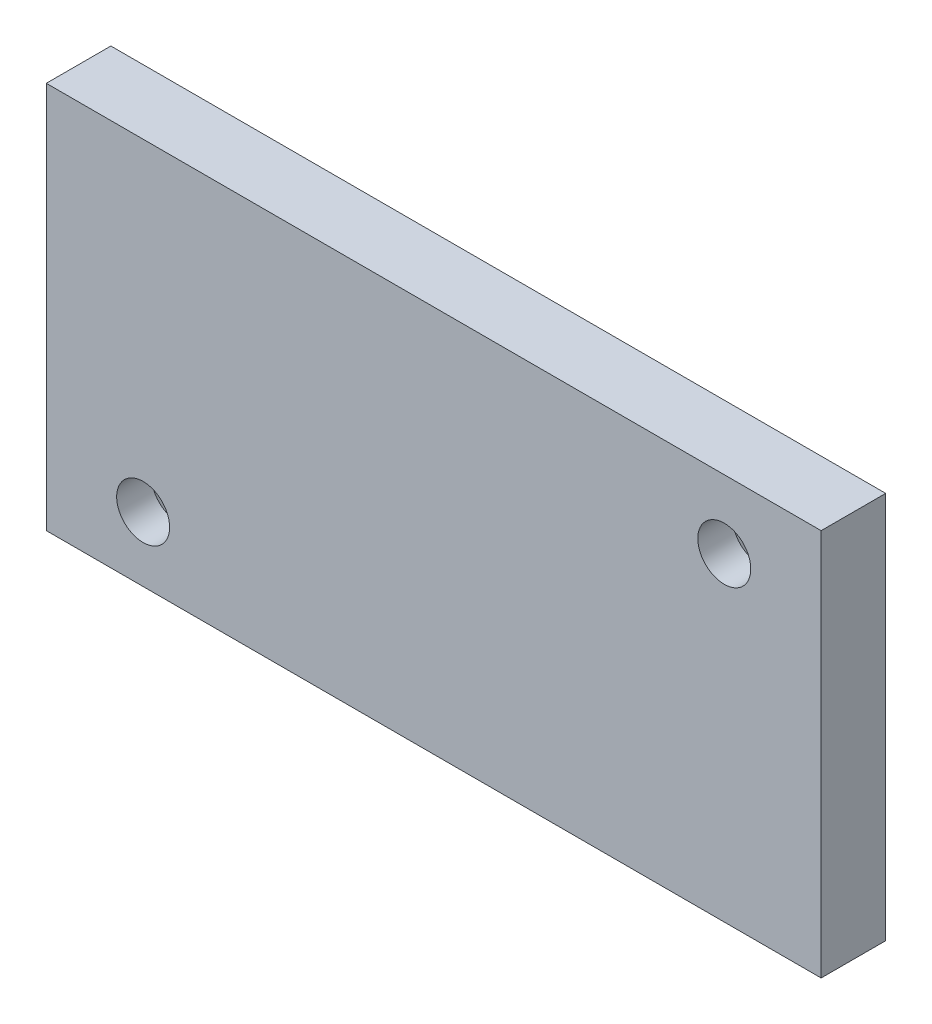
ISO-10303-21;
HEADER;
FILE_DESCRIPTION(('STEP AP214'),'2;1');
FILE_NAME('part.step','',(''),(''),'','','');
FILE_SCHEMA(('AUTOMOTIVE_DESIGN { 1 0 10303 214 1 1 1 1 }'));
ENDSEC;
DATA;
#1=APPLICATION_CONTEXT('core data for automotive mechanical design processes');
#2=APPLICATION_PROTOCOL_DEFINITION('international standard','automotive_design',2000,#1);
#3=PRODUCT_CONTEXT('',#1,'mechanical');
#4=PRODUCT('Part','Part','',(#3));
#5=PRODUCT_RELATED_PRODUCT_CATEGORY('part','',(#4));
#6=PRODUCT_DEFINITION_FORMATION('','',#4);
#7=PRODUCT_DEFINITION_CONTEXT('part definition',#1,'design');
#8=PRODUCT_DEFINITION('design','',#6,#7);
#9=PRODUCT_DEFINITION_SHAPE('','',#8);
#10=(LENGTH_UNIT() NAMED_UNIT(*) SI_UNIT(.MILLI.,.METRE.));
#11=(NAMED_UNIT(*) PLANE_ANGLE_UNIT() SI_UNIT($,.RADIAN.));
#12=(NAMED_UNIT(*) SI_UNIT($,.STERADIAN.) SOLID_ANGLE_UNIT());
#13=UNCERTAINTY_MEASURE_WITH_UNIT(LENGTH_MEASURE(1.E-05),#10,'distance_accuracy_value','');
#14=(GEOMETRIC_REPRESENTATION_CONTEXT(3) GLOBAL_UNCERTAINTY_ASSIGNED_CONTEXT((#13)) GLOBAL_UNIT_ASSIGNED_CONTEXT((#10,
#11,#12)) REPRESENTATION_CONTEXT('',''));
#15=CARTESIAN_POINT('',(0.,0.,0.));
#16=DIRECTION('',(0.,0.,1.));
#17=DIRECTION('',(1.,0.,0.));
#18=AXIS2_PLACEMENT_3D('',#15,#16,#17);
#19=CARTESIAN_POINT('',(0.,0.,17.78));
#20=DIRECTION('',(0.,0.,1.));
#21=DIRECTION('',(1.,0.,0.));
#22=AXIS2_PLACEMENT_3D('',#19,#20,#21);
#23=PLANE('',#22);
#24=DIRECTION('',(0.,-1.,0.));
#25=VECTOR('',#24,1.);
#26=CARTESIAN_POINT('',(-2.54,-2.54000000000001,17.78));
#27=LINE('',#26,#25);
#28=CARTESIAN_POINT('',(-2.54,-28.3861235613282,17.78));
#29=VERTEX_POINT('',#28);
#30=CARTESIAN_POINT('',(-2.54,-32.385,17.78));
#31=VERTEX_POINT('',#30);
#32=EDGE_CURVE('E274',#29,#31,#27,.T.);
#33=ORIENTED_EDGE('',*,*,#32,.F.);
#34=CARTESIAN_POINT('',(-5.715,-28.3861235613282,17.78));
#35=DIRECTION('',(0.,0.,1.));
#36=DIRECTION('',(1.,0.,0.));
#37=AXIS2_PLACEMENT_3D('',#34,#35,#36);
#38=CIRCLE('',#37,3.175);
#39=CARTESIAN_POINT('',(-5.88936147740391,-25.2159148812572,17.78));
#40=VERTEX_POINT('',#39);
#41=EDGE_CURVE('E213',#29,#40,#38,.T.);
#42=ORIENTED_EDGE('',*,*,#41,.T.);
#43=DIRECTION('',(-0.998490922857009,-0.0549170007571353,0.));
#44=VECTOR('',#43,1.);
#45=CARTESIAN_POINT('',(1.36493108347249,-24.816928790409,17.78));
#46=LINE('',#45,#44);
#47=CARTESIAN_POINT('',(-70.6593614774039,-28.7782648812572,17.78));
#48=VERTEX_POINT('',#47);
#49=EDGE_CURVE('E291',#40,#48,#46,.T.);
#50=ORIENTED_EDGE('',*,*,#49,.T.);
#51=CARTESIAN_POINT('',(-70.485,-31.9484735613282,17.78));
#52=DIRECTION('',(0.,0.,1.));
#53=DIRECTION('',(1.,0.,0.));
#54=AXIS2_PLACEMENT_3D('',#51,#52,#53);
#55=CIRCLE('',#54,3.175);
#56=CARTESIAN_POINT('',(-73.66,-31.9484735613282,17.78));
#57=VERTEX_POINT('',#56);
#58=EDGE_CURVE('E357',#48,#57,#55,.T.);
#59=ORIENTED_EDGE('',*,*,#58,.T.);
#60=DIRECTION('',(0.,1.,0.));
#61=VECTOR('',#60,1.);
#62=CARTESIAN_POINT('',(-73.66,-35.56,17.78));
#63=LINE('',#62,#61);
#64=CARTESIAN_POINT('',(-73.66,-32.385,17.78));
#65=VERTEX_POINT('',#64);
#66=EDGE_CURVE('E284',#65,#57,#63,.T.);
#67=ORIENTED_EDGE('',*,*,#66,.F.);
#68=CARTESIAN_POINT('',(-70.485,-32.385,17.78));
#69=DIRECTION('',(0.,0.,1.));
#70=DIRECTION('',(1.,0.,0.));
#71=AXIS2_PLACEMENT_3D('',#68,#69,#70);
#72=CIRCLE('',#71,3.175);
#73=CARTESIAN_POINT('',(-70.485,-35.56,17.78));
#74=VERTEX_POINT('',#73);
#75=EDGE_CURVE('E359',#65,#74,#72,.T.);
#76=ORIENTED_EDGE('',*,*,#75,.T.);
#77=DIRECTION('',(-1.,0.,0.));
#78=VECTOR('',#77,1.);
#79=CARTESIAN_POINT('',(-2.54,-35.56,17.78));
#80=LINE('',#79,#78);
#81=CARTESIAN_POINT('',(-5.715,-35.56,17.78));
#82=VERTEX_POINT('',#81);
#83=EDGE_CURVE('E278',#82,#74,#80,.T.);
#84=ORIENTED_EDGE('',*,*,#83,.F.);
#85=CARTESIAN_POINT('',(-5.715,-32.385,17.78));
#86=DIRECTION('',(0.,0.,1.));
#87=DIRECTION('',(1.,0.,0.));
#88=AXIS2_PLACEMENT_3D('',#85,#86,#87);
#89=CIRCLE('',#88,3.175);
#90=EDGE_CURVE('E354',#82,#31,#89,.T.);
#91=ORIENTED_EDGE('',*,*,#90,.T.);
#92=EDGE_LOOP('',(#33,#42,#50,#59,#67,#76,#84,#91));
#93=FACE_BOUND('',#92,.T.);
#94=DIRECTION('',(-0.998490922857009,0.0549170007571357,0.));
#95=VECTOR('',#94,1.);
#96=CARTESIAN_POINT('',(-0.724249146332348,-13.1681662969517,17.78));
#97=LINE('',#96,#95);
#98=CARTESIAN_POINT('',(-5.88936147740391,-12.8840851187428,17.78));
#99=VERTEX_POINT('',#98);
#100=CARTESIAN_POINT('',(-70.6593614774039,-9.32173511874278,17.78));
#101=VERTEX_POINT('',#100);
#102=EDGE_CURVE('E292',#99,#101,#97,.T.);
#103=ORIENTED_EDGE('',*,*,#102,.F.);
#104=CARTESIAN_POINT('',(-5.715,-9.71387643867179,17.78));
#105=DIRECTION('',(0.,0.,1.));
#106=DIRECTION('',(1.,0.,0.));
#107=AXIS2_PLACEMENT_3D('',#104,#105,#106);
#108=CIRCLE('',#107,3.175);
#109=CARTESIAN_POINT('',(-2.54,-9.71387643867179,17.78));
#110=VERTEX_POINT('',#109);
#111=EDGE_CURVE('E363',#99,#110,#108,.T.);
#112=ORIENTED_EDGE('',*,*,#111,.T.);
#113=CARTESIAN_POINT('',(-2.54,-5.71500000000001,17.78));
#114=VERTEX_POINT('',#113);
#115=EDGE_CURVE('E275',#114,#110,#27,.T.);
#116=ORIENTED_EDGE('',*,*,#115,.F.);
#117=CARTESIAN_POINT('',(-5.715,-5.71500000000001,17.78));
#118=DIRECTION('',(0.,0.,1.));
#119=DIRECTION('',(1.,0.,0.));
#120=AXIS2_PLACEMENT_3D('',#117,#118,#119);
#121=CIRCLE('',#120,3.175);
#122=CARTESIAN_POINT('',(-5.71500000000003,-2.54000000000001,17.78));
#123=VERTEX_POINT('',#122);
#124=EDGE_CURVE('E83',#114,#123,#121,.T.);
#125=ORIENTED_EDGE('',*,*,#124,.T.);
#126=DIRECTION('',(1.,0.,0.));
#127=VECTOR('',#126,1.);
#128=CARTESIAN_POINT('',(-73.66,-2.54,17.78));
#129=LINE('',#128,#127);
#130=CARTESIAN_POINT('',(-70.485,-2.54,17.78));
#131=VERTEX_POINT('',#130);
#132=EDGE_CURVE('E272',#131,#123,#129,.T.);
#133=ORIENTED_EDGE('',*,*,#132,.F.);
#134=CARTESIAN_POINT('',(-70.485,-5.715,17.78));
#135=DIRECTION('',(0.,0.,1.));
#136=DIRECTION('',(1.,0.,0.));
#137=AXIS2_PLACEMENT_3D('',#134,#135,#136);
#138=CIRCLE('',#137,3.175);
#139=CARTESIAN_POINT('',(-73.66,-5.715,17.78));
#140=VERTEX_POINT('',#139);
#141=EDGE_CURVE('E366',#131,#140,#138,.T.);
#142=ORIENTED_EDGE('',*,*,#141,.T.);
#143=CARTESIAN_POINT('',(-73.66,-6.15152643867178,17.78));
#144=VERTEX_POINT('',#143);
#145=EDGE_CURVE('E281',#144,#140,#63,.T.);
#146=ORIENTED_EDGE('',*,*,#145,.F.);
#147=CARTESIAN_POINT('',(-70.485,-6.15152643867178,17.78));
#148=DIRECTION('',(0.,0.,1.));
#149=DIRECTION('',(1.,0.,0.));
#150=AXIS2_PLACEMENT_3D('',#147,#148,#149);
#151=CIRCLE('',#150,3.175);
#152=EDGE_CURVE('E361',#144,#101,#151,.T.);
#153=ORIENTED_EDGE('',*,*,#152,.T.);
#154=EDGE_LOOP('',(#103,#112,#116,#125,#133,#142,#146,#153));
#155=FACE_BOUND('',#154,.T.);
#156=DIRECTION('',(-1.,0.,0.));
#157=VECTOR('',#156,1.);
#158=CARTESIAN_POINT('',(0.,-38.1,17.78));
#159=LINE('',#158,#157);
#160=CARTESIAN_POINT('',(0.,-38.1,17.78));
#161=VERTEX_POINT('',#160);
#162=CARTESIAN_POINT('',(-76.2,-38.1,17.78));
#163=VERTEX_POINT('',#162);
#164=EDGE_CURVE('E285',#161,#163,#159,.T.);
#165=ORIENTED_EDGE('',*,*,#164,.T.);
#166=DIRECTION('',(0.,-1.,0.));
#167=VECTOR('',#166,1.);
#168=CARTESIAN_POINT('',(-76.2,0.,17.78));
#169=LINE('',#168,#167);
#170=CARTESIAN_POINT('',(-76.2,0.,17.78));
#171=VERTEX_POINT('',#170);
#172=EDGE_CURVE('E303',#171,#163,#169,.T.);
#173=ORIENTED_EDGE('',*,*,#172,.F.);
#174=DIRECTION('',(1.,0.,0.));
#175=VECTOR('',#174,1.);
#176=CARTESIAN_POINT('',(-76.2,0.,17.78));
#177=LINE('',#176,#175);
#178=CARTESIAN_POINT('',(0.,0.,17.78));
#179=VERTEX_POINT('',#178);
#180=EDGE_CURVE('E288',#171,#179,#177,.T.);
#181=ORIENTED_EDGE('',*,*,#180,.T.);
#182=DIRECTION('',(0.,1.,0.));
#183=VECTOR('',#182,1.);
#184=CARTESIAN_POINT('',(0.,0.,17.78));
#185=LINE('',#184,#183);
#186=EDGE_CURVE('E308',#161,#179,#185,.T.);
#187=ORIENTED_EDGE('',*,*,#186,.F.);
#188=EDGE_LOOP('',(#165,#173,#181,#187));
#189=FACE_BOUND('',#188,.T.);
#190=ADVANCED_FACE('F67',(#93,#155,#189),#23,.F.);
#191=CARTESIAN_POINT('',(-76.2,0.,24.13));
#192=DIRECTION('',(1.,0.,0.));
#193=DIRECTION('',(0.,0.,-1.));
#194=AXIS2_PLACEMENT_3D('',#191,#192,#193);
#195=PLANE('',#194);
#196=ORIENTED_EDGE('',*,*,#172,.T.);
#197=DIRECTION('',(0.,0.,-1.));
#198=VECTOR('',#197,1.);
#199=CARTESIAN_POINT('',(-76.2,-38.1,24.13));
#200=LINE('',#199,#198);
#201=CARTESIAN_POINT('',(-76.2,-38.1,24.13));
#202=VERTEX_POINT('',#201);
#203=EDGE_CURVE('E218',#202,#163,#200,.T.);
#204=ORIENTED_EDGE('',*,*,#203,.F.);
#205=DIRECTION('',(0.,-1.,0.));
#206=VECTOR('',#205,1.);
#207=CARTESIAN_POINT('',(-76.2,0.,24.13));
#208=LINE('',#207,#206);
#209=CARTESIAN_POINT('',(-76.2,0.,24.13));
#210=VERTEX_POINT('',#209);
#211=EDGE_CURVE('E304',#210,#202,#208,.T.);
#212=ORIENTED_EDGE('',*,*,#211,.F.);
#213=DIRECTION('',(0.,0.,-1.));
#214=VECTOR('',#213,1.);
#215=CARTESIAN_POINT('',(-76.2,0.,24.13));
#216=LINE('',#215,#214);
#217=EDGE_CURVE('E314',#210,#171,#216,.T.);
#218=ORIENTED_EDGE('',*,*,#217,.T.);
#219=EDGE_LOOP('',(#196,#204,#212,#218));
#220=FACE_BOUND('',#219,.T.);
#221=ADVANCED_FACE('F388',(#220),#195,.F.);
#222=CARTESIAN_POINT('',(-76.2,-38.1,24.13));
#223=DIRECTION('',(0.,1.,0.));
#224=DIRECTION('',(0.,0.,1.));
#225=AXIS2_PLACEMENT_3D('',#222,#223,#224);
#226=PLANE('',#225);
#227=ORIENTED_EDGE('',*,*,#164,.F.);
#228=DIRECTION('',(0.,0.,-1.));
#229=VECTOR('',#228,1.);
#230=CARTESIAN_POINT('',(0.,-38.1,24.13));
#231=LINE('',#230,#229);
#232=CARTESIAN_POINT('',(0.,-38.1,24.13));
#233=VERTEX_POINT('',#232);
#234=EDGE_CURVE('E322',#233,#161,#231,.T.);
#235=ORIENTED_EDGE('',*,*,#234,.F.);
#236=DIRECTION('',(1.,0.,0.));
#237=VECTOR('',#236,1.);
#238=CARTESIAN_POINT('',(-76.2,-38.1,24.13));
#239=LINE('',#238,#237);
#240=EDGE_CURVE('E307',#202,#233,#239,.T.);
#241=ORIENTED_EDGE('',*,*,#240,.F.);
#242=ORIENTED_EDGE('',*,*,#203,.T.);
#243=EDGE_LOOP('',(#227,#235,#241,#242));
#244=FACE_BOUND('',#243,.T.);
#245=ADVANCED_FACE('F396',(#244),#226,.F.);
#246=CARTESIAN_POINT('',(0.,0.,24.13));
#247=DIRECTION('',(-1.,0.,0.));
#248=DIRECTION('',(0.,0.,1.));
#249=AXIS2_PLACEMENT_3D('',#246,#247,#248);
#250=PLANE('',#249);
#251=ORIENTED_EDGE('',*,*,#234,.T.);
#252=ORIENTED_EDGE('',*,*,#186,.T.);
#253=DIRECTION('',(0.,0.,-1.));
#254=VECTOR('',#253,1.);
#255=CARTESIAN_POINT('',(0.,0.,24.13));
#256=LINE('',#255,#254);
#257=CARTESIAN_POINT('',(0.,0.,24.13));
#258=VERTEX_POINT('',#257);
#259=EDGE_CURVE('E320',#258,#179,#256,.T.);
#260=ORIENTED_EDGE('',*,*,#259,.F.);
#261=DIRECTION('',(0.,1.,0.));
#262=VECTOR('',#261,1.);
#263=CARTESIAN_POINT('',(0.,0.,24.13));
#264=LINE('',#263,#262);
#265=EDGE_CURVE('E310',#233,#258,#264,.T.);
#266=ORIENTED_EDGE('',*,*,#265,.F.);
#267=EDGE_LOOP('',(#251,#252,#260,#266));
#268=FACE_BOUND('',#267,.T.);
#269=ADVANCED_FACE('F406',(#268),#250,.F.);
#270=CARTESIAN_POINT('',(-76.2,0.,24.13));
#271=DIRECTION('',(0.,-1.,0.));
#272=DIRECTION('',(0.,0.,-1.));
#273=AXIS2_PLACEMENT_3D('',#270,#271,#272);
#274=PLANE('',#273);
#275=ORIENTED_EDGE('',*,*,#180,.F.);
#276=ORIENTED_EDGE('',*,*,#217,.F.);
#277=DIRECTION('',(-1.,0.,0.));
#278=VECTOR('',#277,1.);
#279=CARTESIAN_POINT('',(-76.2,0.,24.13));
#280=LINE('',#279,#278);
#281=EDGE_CURVE('E312',#258,#210,#280,.T.);
#282=ORIENTED_EDGE('',*,*,#281,.F.);
#283=ORIENTED_EDGE('',*,*,#259,.T.);
#284=EDGE_LOOP('',(#275,#276,#282,#283));
#285=FACE_BOUND('',#284,.T.);
#286=ADVANCED_FACE('F403',(#285),#274,.F.);
#287=CARTESIAN_POINT('',(-9.52500000000001,-6.731,24.13));
#288=DIRECTION('',(0.,0.,-1.));
#289=DIRECTION('',(-1.,0.,0.));
#290=AXIS2_PLACEMENT_3D('',#287,#288,#289);
#291=CYLINDRICAL_SURFACE('',#290,2.6035);
#292=CARTESIAN_POINT('',(-9.52500000000001,-6.731,20.701));
#293=DIRECTION('',(0.,0.,1.));
#294=DIRECTION('',(1.,0.,0.));
#295=AXIS2_PLACEMENT_3D('',#292,#293,#294);
#296=CIRCLE('',#295,2.6035);
#297=CARTESIAN_POINT('',(-6.92150000000001,-6.731,20.701));
#298=VERTEX_POINT('',#297);
#299=EDGE_CURVE('E12',#298,#298,#296,.F.);
#300=ORIENTED_EDGE('',*,*,#299,.T.);
#301=EDGE_LOOP('',(#300));
#302=FACE_BOUND('',#301,.T.);
#303=CARTESIAN_POINT('',(-9.52500000000001,-6.731,24.13));
#304=DIRECTION('',(0.,0.,1.));
#305=DIRECTION('',(1.,0.,0.));
#306=AXIS2_PLACEMENT_3D('',#303,#304,#305);
#307=CIRCLE('',#306,2.6035);
#308=CARTESIAN_POINT('',(-6.92150000000001,-6.731,24.13));
#309=VERTEX_POINT('',#308);
#310=EDGE_CURVE('E300',#309,#309,#307,.T.);
#311=ORIENTED_EDGE('',*,*,#310,.T.);
#312=EDGE_LOOP('',(#311));
#313=FACE_BOUND('',#312,.T.);
#314=ADVANCED_FACE('F405',(#302,#313),#291,.F.);
#315=CARTESIAN_POINT('',(-66.675,-31.75,24.13));
#316=DIRECTION('',(0.,0.,-1.));
#317=DIRECTION('',(-1.,0.,0.));
#318=AXIS2_PLACEMENT_3D('',#315,#316,#317);
#319=CYLINDRICAL_SURFACE('',#318,2.60349999999999);
#320=CARTESIAN_POINT('',(-66.675,-31.75,20.701));
#321=DIRECTION('',(0.,0.,1.));
#322=DIRECTION('',(1.,0.,0.));
#323=AXIS2_PLACEMENT_3D('',#320,#321,#322);
#324=CIRCLE('',#323,2.60349999999999);
#325=CARTESIAN_POINT('',(-64.0715,-31.75,20.701));
#326=VERTEX_POINT('',#325);
#327=EDGE_CURVE('E371',#326,#326,#324,.F.);
#328=ORIENTED_EDGE('',*,*,#327,.T.);
#329=EDGE_LOOP('',(#328));
#330=FACE_BOUND('',#329,.T.);
#331=CARTESIAN_POINT('',(-66.675,-31.75,24.13));
#332=DIRECTION('',(0.,0.,1.));
#333=DIRECTION('',(1.,0.,0.));
#334=AXIS2_PLACEMENT_3D('',#331,#332,#333);
#335=CIRCLE('',#334,2.60349999999999);
#336=CARTESIAN_POINT('',(-64.0715,-31.75,24.13));
#337=VERTEX_POINT('',#336);
#338=EDGE_CURVE('E295',#337,#337,#335,.T.);
#339=ORIENTED_EDGE('',*,*,#338,.T.);
#340=EDGE_LOOP('',(#339));
#341=FACE_BOUND('',#340,.T.);
#342=ADVANCED_FACE('F491',(#330,#341),#319,.F.);
#343=CARTESIAN_POINT('',(0.,0.,24.13));
#344=DIRECTION('',(0.,0.,1.));
#345=DIRECTION('',(1.,0.,0.));
#346=AXIS2_PLACEMENT_3D('',#343,#344,#345);
#347=PLANE('',#346);
#348=ORIENTED_EDGE('',*,*,#310,.F.);
#349=EDGE_LOOP('',(#348));
#350=FACE_BOUND('',#349,.T.);
#351=ORIENTED_EDGE('',*,*,#211,.T.);
#352=ORIENTED_EDGE('',*,*,#240,.T.);
#353=ORIENTED_EDGE('',*,*,#265,.T.);
#354=ORIENTED_EDGE('',*,*,#281,.T.);
#355=EDGE_LOOP('',(#351,#352,#353,#354));
#356=FACE_BOUND('',#355,.T.);
#357=ORIENTED_EDGE('',*,*,#338,.F.);
#358=EDGE_LOOP('',(#357));
#359=FACE_BOUND('',#358,.T.);
#360=ADVANCED_FACE('F401',(#350,#356,#359),#347,.T.);
#361=CARTESIAN_POINT('',(1.36493108347249,-24.816928790409,18.415));
#362=DIRECTION('',(0.0549170007571353,-0.998490922857009,0.));
#363=DIRECTION('',(0.998490922857009,0.0549170007571353,0.));
#364=AXIS2_PLACEMENT_3D('',#361,#362,#363);
#365=PLANE('',#364);
#366=ORIENTED_EDGE('',*,*,#49,.F.);
#367=DIRECTION('',(0.,0.,-1.));
#368=VECTOR('',#367,1.);
#369=CARTESIAN_POINT('',(-5.88936147740391,-25.2159148812572,18.415));
#370=LINE('',#369,#368);
#371=CARTESIAN_POINT('',(-5.88936147740391,-25.2159148812572,19.685));
#372=VERTEX_POINT('',#371);
#373=EDGE_CURVE('E332',#40,#372,#370,.F.);
#374=ORIENTED_EDGE('',*,*,#373,.T.);
#375=DIRECTION('',(0.998490922857009,0.0549170007571353,0.));
#376=VECTOR('',#375,1.);
#377=CARTESIAN_POINT('',(-5.88936147740391,-25.2159148812572,19.685));
#378=LINE('',#377,#376);
#379=CARTESIAN_POINT('',(-70.6593614774039,-28.7782648812572,19.685));
#380=VERTEX_POINT('',#379);
#381=EDGE_CURVE('E232',#380,#372,#378,.T.);
#382=ORIENTED_EDGE('',*,*,#381,.F.);
#383=DIRECTION('',(0.,0.,1.));
#384=VECTOR('',#383,1.);
#385=CARTESIAN_POINT('',(-70.6593614774039,-28.7782648812572,17.78));
#386=LINE('',#385,#384);
#387=EDGE_CURVE('E330',#380,#48,#386,.F.);
#388=ORIENTED_EDGE('',*,*,#387,.T.);
#389=EDGE_LOOP('',(#366,#374,#382,#388));
#390=FACE_BOUND('',#389,.T.);
#391=ADVANCED_FACE('F488',(#390),#365,.T.);
#392=CARTESIAN_POINT('',(-0.724249146332348,-13.1681662969517,18.415));
#393=DIRECTION('',(-0.0549170007571357,-0.998490922857009,0.));
#394=DIRECTION('',(0.998490922857009,-0.0549170007571357,0.));
#395=AXIS2_PLACEMENT_3D('',#392,#393,#394);
#396=PLANE('',#395);
#397=ORIENTED_EDGE('',*,*,#102,.T.);
#398=DIRECTION('',(0.,0.,1.));
#399=VECTOR('',#398,1.);
#400=CARTESIAN_POINT('',(-70.6593614774039,-9.32173511874278,18.415));
#401=LINE('',#400,#399);
#402=CARTESIAN_POINT('',(-70.6593614774039,-9.32173511874278,19.685));
#403=VERTEX_POINT('',#402);
#404=EDGE_CURVE('E341',#101,#403,#401,.T.);
#405=ORIENTED_EDGE('',*,*,#404,.T.);
#406=DIRECTION('',(-0.998490922857008,0.0549170007571356,0.));
#407=VECTOR('',#406,1.);
#408=CARTESIAN_POINT('',(-5.88936147740391,-12.8840851187428,19.685));
#409=LINE('',#408,#407);
#410=CARTESIAN_POINT('',(-5.88936147740391,-12.8840851187428,19.685));
#411=VERTEX_POINT('',#410);
#412=EDGE_CURVE('E257',#411,#403,#409,.T.);
#413=ORIENTED_EDGE('',*,*,#412,.F.);
#414=DIRECTION('',(0.,0.,-1.));
#415=VECTOR('',#414,1.);
#416=CARTESIAN_POINT('',(-5.88936147740391,-12.8840851187428,18.415));
#417=LINE('',#416,#415);
#418=EDGE_CURVE('E338',#411,#99,#417,.T.);
#419=ORIENTED_EDGE('',*,*,#418,.T.);
#420=EDGE_LOOP('',(#397,#405,#413,#419));
#421=FACE_BOUND('',#420,.T.);
#422=ADVANCED_FACE('F467',(#421),#396,.F.);
#423=CARTESIAN_POINT('',(-73.66,-35.56,17.78));
#424=DIRECTION('',(1.,0.,0.));
#425=DIRECTION('',(0.,0.,-1.));
#426=AXIS2_PLACEMENT_3D('',#423,#424,#425);
#427=PLANE('',#426);
#428=DIRECTION('',(0.,0.,1.));
#429=VECTOR('',#428,1.);
#430=CARTESIAN_POINT('',(-73.66,-5.715,18.415));
#431=LINE('',#430,#429);
#432=CARTESIAN_POINT('',(-73.66,-5.715,19.685));
#433=VERTEX_POINT('',#432);
#434=EDGE_CURVE('E343',#140,#433,#431,.T.);
#435=ORIENTED_EDGE('',*,*,#434,.T.);
#436=DIRECTION('',(0.,1.,0.));
#437=VECTOR('',#436,1.);
#438=CARTESIAN_POINT('',(-73.66,-6.15152643867178,19.685));
#439=LINE('',#438,#437);
#440=CARTESIAN_POINT('',(-73.66,-6.15152643867178,19.685));
#441=VERTEX_POINT('',#440);
#442=EDGE_CURVE('E263',#441,#433,#439,.T.);
#443=ORIENTED_EDGE('',*,*,#442,.F.);
#444=DIRECTION('',(0.,0.,1.));
#445=VECTOR('',#444,1.);
#446=CARTESIAN_POINT('',(-73.66,-6.15152643867178,17.78));
#447=LINE('',#446,#445);
#448=EDGE_CURVE('E345',#441,#144,#447,.F.);
#449=ORIENTED_EDGE('',*,*,#448,.T.);
#450=ORIENTED_EDGE('',*,*,#145,.T.);
#451=EDGE_LOOP('',(#435,#443,#449,#450));
#452=FACE_BOUND('',#451,.T.);
#453=ADVANCED_FACE('F462',(#452),#427,.T.);
#454=CARTESIAN_POINT('',(-2.54,-2.54000000000001,17.78));
#455=DIRECTION('',(-1.,0.,0.));
#456=DIRECTION('',(0.,-1.,0.));
#457=AXIS2_PLACEMENT_3D('',#454,#455,#456);
#458=PLANE('',#457);
#459=ORIENTED_EDGE('',*,*,#115,.T.);
#460=DIRECTION('',(0.,0.,-1.));
#461=VECTOR('',#460,1.);
#462=CARTESIAN_POINT('',(-2.54,-9.71387643867179,17.78));
#463=LINE('',#462,#461);
#464=CARTESIAN_POINT('',(-2.54,-9.71387643867179,19.685));
#465=VERTEX_POINT('',#464);
#466=EDGE_CURVE('E349',#110,#465,#463,.F.);
#467=ORIENTED_EDGE('',*,*,#466,.T.);
#468=DIRECTION('',(0.,-1.,0.));
#469=VECTOR('',#468,1.);
#470=CARTESIAN_POINT('',(-2.54,-9.71387643867179,19.685));
#471=LINE('',#470,#469);
#472=CARTESIAN_POINT('',(-2.54,-5.71500000000001,19.685));
#473=VERTEX_POINT('',#472);
#474=EDGE_CURVE('E251',#473,#465,#471,.T.);
#475=ORIENTED_EDGE('',*,*,#474,.F.);
#476=DIRECTION('',(0.,0.,1.));
#477=VECTOR('',#476,1.);
#478=CARTESIAN_POINT('',(-2.54,-5.71500000000001,17.78));
#479=LINE('',#478,#477);
#480=EDGE_CURVE('E347',#473,#114,#479,.F.);
#481=ORIENTED_EDGE('',*,*,#480,.T.);
#482=EDGE_LOOP('',(#459,#467,#475,#481));
#483=FACE_BOUND('',#482,.T.);
#484=ADVANCED_FACE('F472',(#483),#458,.T.);
#485=CARTESIAN_POINT('',(-73.66,-2.54,17.78));
#486=DIRECTION('',(0.,-1.,0.));
#487=DIRECTION('',(1.,0.,0.));
#488=AXIS2_PLACEMENT_3D('',#485,#486,#487);
#489=PLANE('',#488);
#490=ORIENTED_EDGE('',*,*,#132,.T.);
#491=DIRECTION('',(0.,0.,1.));
#492=VECTOR('',#491,1.);
#493=CARTESIAN_POINT('',(-5.715,-2.54000000000001,18.415));
#494=LINE('',#493,#492);
#495=CARTESIAN_POINT('',(-5.715,-2.54000000000001,19.685));
#496=VERTEX_POINT('',#495);
#497=EDGE_CURVE('E352',#123,#496,#494,.T.);
#498=ORIENTED_EDGE('',*,*,#497,.T.);
#499=DIRECTION('',(1.,0.,0.));
#500=VECTOR('',#499,1.);
#501=CARTESIAN_POINT('',(-5.715,-2.54000000000001,19.685));
#502=LINE('',#501,#500);
#503=CARTESIAN_POINT('',(-70.485,-2.54,19.685));
#504=VERTEX_POINT('',#503);
#505=EDGE_CURVE('E269',#504,#496,#502,.T.);
#506=ORIENTED_EDGE('',*,*,#505,.F.);
#507=DIRECTION('',(0.,0.,1.));
#508=VECTOR('',#507,1.);
#509=CARTESIAN_POINT('',(-70.485,-2.54,17.78));
#510=LINE('',#509,#508);
#511=EDGE_CURVE('E90',#504,#131,#510,.F.);
#512=ORIENTED_EDGE('',*,*,#511,.T.);
#513=EDGE_LOOP('',(#490,#498,#506,#512));
#514=FACE_BOUND('',#513,.T.);
#515=ADVANCED_FACE('F476',(#514),#489,.T.);
#516=ORIENTED_EDGE('',*,*,#32,.T.);
#517=DIRECTION('',(0.,0.,1.));
#518=VECTOR('',#517,1.);
#519=CARTESIAN_POINT('',(-2.54,-32.385,18.415));
#520=LINE('',#519,#518);
#521=CARTESIAN_POINT('',(-2.54,-32.385,19.685));
#522=VERTEX_POINT('',#521);
#523=EDGE_CURVE('E217',#31,#522,#520,.T.);
#524=ORIENTED_EDGE('',*,*,#523,.T.);
#525=DIRECTION('',(0.,-1.,0.));
#526=VECTOR('',#525,1.);
#527=CARTESIAN_POINT('',(-2.54,-28.3861235613282,19.685));
#528=LINE('',#527,#526);
#529=CARTESIAN_POINT('',(-2.54,-28.3861235613282,19.685));
#530=VERTEX_POINT('',#529);
#531=EDGE_CURVE('E221',#530,#522,#528,.T.);
#532=ORIENTED_EDGE('',*,*,#531,.F.);
#533=DIRECTION('',(0.,0.,-1.));
#534=VECTOR('',#533,1.);
#535=CARTESIAN_POINT('',(-2.54,-28.3861235613282,17.78));
#536=LINE('',#535,#534);
#537=EDGE_CURVE('E206',#530,#29,#536,.T.);
#538=ORIENTED_EDGE('',*,*,#537,.T.);
#539=EDGE_LOOP('',(#516,#524,#532,#538));
#540=FACE_BOUND('',#539,.T.);
#541=ADVANCED_FACE('F222',(#540),#458,.T.);
#542=CARTESIAN_POINT('',(-2.54,-35.56,17.78));
#543=DIRECTION('',(0.,1.,0.));
#544=DIRECTION('',(0.,0.,1.));
#545=AXIS2_PLACEMENT_3D('',#542,#543,#544);
#546=PLANE('',#545);
#547=DIRECTION('',(0.,0.,1.));
#548=VECTOR('',#547,1.);
#549=CARTESIAN_POINT('',(-70.485,-35.56,18.415));
#550=LINE('',#549,#548);
#551=CARTESIAN_POINT('',(-70.485,-35.56,19.685));
#552=VERTEX_POINT('',#551);
#553=EDGE_CURVE('E326',#74,#552,#550,.T.);
#554=ORIENTED_EDGE('',*,*,#553,.T.);
#555=DIRECTION('',(-1.,0.,0.));
#556=VECTOR('',#555,1.);
#557=CARTESIAN_POINT('',(-70.485,-35.56,19.685));
#558=LINE('',#557,#556);
#559=CARTESIAN_POINT('',(-5.715,-35.56,19.685));
#560=VERTEX_POINT('',#559);
#561=EDGE_CURVE('E236',#560,#552,#558,.T.);
#562=ORIENTED_EDGE('',*,*,#561,.F.);
#563=DIRECTION('',(0.,0.,1.));
#564=VECTOR('',#563,1.);
#565=CARTESIAN_POINT('',(-5.715,-35.56,17.78));
#566=LINE('',#565,#564);
#567=EDGE_CURVE('E328',#560,#82,#566,.F.);
#568=ORIENTED_EDGE('',*,*,#567,.T.);
#569=ORIENTED_EDGE('',*,*,#83,.T.);
#570=EDGE_LOOP('',(#554,#562,#568,#569));
#571=FACE_BOUND('',#570,.T.);
#572=ADVANCED_FACE('F483',(#571),#546,.T.);
#573=ORIENTED_EDGE('',*,*,#66,.T.);
#574=DIRECTION('',(0.,0.,1.));
#575=VECTOR('',#574,1.);
#576=CARTESIAN_POINT('',(-73.66,-31.9484735613282,18.415));
#577=LINE('',#576,#575);
#578=CARTESIAN_POINT('',(-73.66,-31.9484735613282,19.685));
#579=VERTEX_POINT('',#578);
#580=EDGE_CURVE('E336',#57,#579,#577,.T.);
#581=ORIENTED_EDGE('',*,*,#580,.T.);
#582=DIRECTION('',(0.,1.,0.));
#583=VECTOR('',#582,1.);
#584=CARTESIAN_POINT('',(-73.66,-31.9484735613282,19.685));
#585=LINE('',#584,#583);
#586=CARTESIAN_POINT('',(-73.66,-32.385,19.685));
#587=VERTEX_POINT('',#586);
#588=EDGE_CURVE('E242',#587,#579,#585,.T.);
#589=ORIENTED_EDGE('',*,*,#588,.F.);
#590=DIRECTION('',(0.,0.,1.));
#591=VECTOR('',#590,1.);
#592=CARTESIAN_POINT('',(-73.66,-32.385,17.78));
#593=LINE('',#592,#591);
#594=EDGE_CURVE('E334',#587,#65,#593,.F.);
#595=ORIENTED_EDGE('',*,*,#594,.T.);
#596=EDGE_LOOP('',(#573,#581,#589,#595));
#597=FACE_BOUND('',#596,.T.);
#598=ADVANCED_FACE('F417',(#597),#427,.T.);
#599=CARTESIAN_POINT('',(-5.715,-32.385,17.78));
#600=DIRECTION('',(0.,0.,-1.));
#601=DIRECTION('',(-1.,0.,0.));
#602=AXIS2_PLACEMENT_3D('',#599,#600,#601);
#603=CYLINDRICAL_SURFACE('',#602,3.175);
#604=ORIENTED_EDGE('',*,*,#90,.F.);
#605=ORIENTED_EDGE('',*,*,#567,.F.);
#606=CARTESIAN_POINT('',(-5.715,-32.385,19.685));
#607=DIRECTION('',(0.,0.,-1.));
#608=DIRECTION('',(-1.,0.,0.));
#609=AXIS2_PLACEMENT_3D('',#606,#607,#608);
#610=CIRCLE('',#609,3.17499999999999);
#611=EDGE_CURVE('E227',#522,#560,#610,.T.);
#612=ORIENTED_EDGE('',*,*,#611,.F.);
#613=ORIENTED_EDGE('',*,*,#523,.F.);
#614=EDGE_LOOP('',(#604,#605,#612,#613));
#615=FACE_BOUND('',#614,.T.);
#616=ADVANCED_FACE('F414',(#615),#603,.F.);
#617=CARTESIAN_POINT('',(-5.715,-28.3861235613282,17.78));
#618=DIRECTION('',(0.,0.,1.));
#619=DIRECTION('',(1.,0.,0.));
#620=AXIS2_PLACEMENT_3D('',#617,#618,#619);
#621=CYLINDRICAL_SURFACE('',#620,3.175);
#622=ORIENTED_EDGE('',*,*,#537,.F.);
#623=CARTESIAN_POINT('',(-5.715,-28.3861235613282,19.685));
#624=DIRECTION('',(0.,0.,-1.));
#625=DIRECTION('',(1.,0.,0.));
#626=AXIS2_PLACEMENT_3D('',#623,#624,#625);
#627=CIRCLE('',#626,3.175);
#628=EDGE_CURVE('E211',#372,#530,#627,.T.);
#629=ORIENTED_EDGE('',*,*,#628,.F.);
#630=ORIENTED_EDGE('',*,*,#373,.F.);
#631=ORIENTED_EDGE('',*,*,#41,.F.);
#632=EDGE_LOOP('',(#622,#629,#630,#631));
#633=FACE_BOUND('',#632,.T.);
#634=ADVANCED_FACE('F208',(#633),#621,.F.);
#635=CARTESIAN_POINT('',(-70.485,-31.9484735613282,17.78));
#636=DIRECTION('',(0.,0.,-1.));
#637=DIRECTION('',(-1.,0.,0.));
#638=AXIS2_PLACEMENT_3D('',#635,#636,#637);
#639=CYLINDRICAL_SURFACE('',#638,3.175);
#640=ORIENTED_EDGE('',*,*,#58,.F.);
#641=ORIENTED_EDGE('',*,*,#387,.F.);
#642=CARTESIAN_POINT('',(-70.485,-31.9484735613282,19.685));
#643=DIRECTION('',(0.,0.,-1.));
#644=DIRECTION('',(1.,0.,0.));
#645=AXIS2_PLACEMENT_3D('',#642,#643,#644);
#646=CIRCLE('',#645,3.17499999999998);
#647=EDGE_CURVE('E245',#579,#380,#646,.T.);
#648=ORIENTED_EDGE('',*,*,#647,.F.);
#649=ORIENTED_EDGE('',*,*,#580,.F.);
#650=EDGE_LOOP('',(#640,#641,#648,#649));
#651=FACE_BOUND('',#650,.T.);
#652=ADVANCED_FACE('F421',(#651),#639,.F.);
#653=CARTESIAN_POINT('',(-70.485,-32.385,17.78));
#654=DIRECTION('',(0.,0.,-1.));
#655=DIRECTION('',(-1.,0.,0.));
#656=AXIS2_PLACEMENT_3D('',#653,#654,#655);
#657=CYLINDRICAL_SURFACE('',#656,3.175);
#658=ORIENTED_EDGE('',*,*,#75,.F.);
#659=ORIENTED_EDGE('',*,*,#594,.F.);
#660=CARTESIAN_POINT('',(-70.485,-32.385,19.685));
#661=DIRECTION('',(0.,0.,-1.));
#662=DIRECTION('',(1.,0.,0.));
#663=AXIS2_PLACEMENT_3D('',#660,#661,#662);
#664=CIRCLE('',#663,3.17499999999998);
#665=EDGE_CURVE('E239',#552,#587,#664,.T.);
#666=ORIENTED_EDGE('',*,*,#665,.F.);
#667=ORIENTED_EDGE('',*,*,#553,.F.);
#668=EDGE_LOOP('',(#658,#659,#666,#667));
#669=FACE_BOUND('',#668,.T.);
#670=ADVANCED_FACE('F424',(#669),#657,.F.);
#671=CARTESIAN_POINT('',(-70.485,-6.15152643867178,18.415));
#672=DIRECTION('',(0.,0.,1.));
#673=DIRECTION('',(1.,0.,0.));
#674=AXIS2_PLACEMENT_3D('',#671,#672,#673);
#675=CYLINDRICAL_SURFACE('',#674,3.175);
#676=ORIENTED_EDGE('',*,*,#152,.F.);
#677=ORIENTED_EDGE('',*,*,#448,.F.);
#678=CARTESIAN_POINT('',(-70.485,-6.15152643867181,19.685));
#679=DIRECTION('',(0.,0.,-1.));
#680=DIRECTION('',(1.,0.,0.));
#681=AXIS2_PLACEMENT_3D('',#678,#679,#680);
#682=CIRCLE('',#681,3.17499999999997);
#683=EDGE_CURVE('E260',#403,#441,#682,.T.);
#684=ORIENTED_EDGE('',*,*,#683,.F.);
#685=ORIENTED_EDGE('',*,*,#404,.F.);
#686=EDGE_LOOP('',(#676,#677,#684,#685));
#687=FACE_BOUND('',#686,.T.);
#688=ADVANCED_FACE('F428',(#687),#675,.F.);
#689=CARTESIAN_POINT('',(-5.715,-9.71387643867179,18.415));
#690=DIRECTION('',(0.,0.,-1.));
#691=DIRECTION('',(-1.,0.,0.));
#692=AXIS2_PLACEMENT_3D('',#689,#690,#691);
#693=CYLINDRICAL_SURFACE('',#692,3.175);
#694=ORIENTED_EDGE('',*,*,#418,.F.);
#695=CARTESIAN_POINT('',(-5.715,-9.71387643867179,19.685));
#696=DIRECTION('',(0.,0.,-1.));
#697=DIRECTION('',(-1.,0.,0.));
#698=AXIS2_PLACEMENT_3D('',#695,#696,#697);
#699=CIRCLE('',#698,3.175);
#700=EDGE_CURVE('E254',#465,#411,#699,.T.);
#701=ORIENTED_EDGE('',*,*,#700,.F.);
#702=ORIENTED_EDGE('',*,*,#466,.F.);
#703=ORIENTED_EDGE('',*,*,#111,.F.);
#704=EDGE_LOOP('',(#694,#701,#702,#703));
#705=FACE_BOUND('',#704,.T.);
#706=ADVANCED_FACE('F432',(#705),#693,.F.);
#707=CARTESIAN_POINT('',(-5.715,-5.71500000000001,17.78));
#708=DIRECTION('',(0.,0.,-1.));
#709=DIRECTION('',(-1.,0.,0.));
#710=AXIS2_PLACEMENT_3D('',#707,#708,#709);
#711=CYLINDRICAL_SURFACE('',#710,3.175);
#712=ORIENTED_EDGE('',*,*,#124,.F.);
#713=ORIENTED_EDGE('',*,*,#480,.F.);
#714=CARTESIAN_POINT('',(-5.715,-5.71500000000001,19.685));
#715=DIRECTION('',(0.,0.,-1.));
#716=DIRECTION('',(1.,0.,0.));
#717=AXIS2_PLACEMENT_3D('',#714,#715,#716);
#718=CIRCLE('',#717,3.175);
#719=EDGE_CURVE('E248',#496,#473,#718,.T.);
#720=ORIENTED_EDGE('',*,*,#719,.F.);
#721=ORIENTED_EDGE('',*,*,#497,.F.);
#722=EDGE_LOOP('',(#712,#713,#720,#721));
#723=FACE_BOUND('',#722,.T.);
#724=ADVANCED_FACE('F436',(#723),#711,.F.);
#725=CARTESIAN_POINT('',(-70.485,-5.715,17.78));
#726=DIRECTION('',(0.,0.,-1.));
#727=DIRECTION('',(-1.,0.,0.));
#728=AXIS2_PLACEMENT_3D('',#725,#726,#727);
#729=CYLINDRICAL_SURFACE('',#728,3.175);
#730=ORIENTED_EDGE('',*,*,#141,.F.);
#731=ORIENTED_EDGE('',*,*,#511,.F.);
#732=CARTESIAN_POINT('',(-70.485,-5.715,19.685));
#733=DIRECTION('',(0.,0.,-1.));
#734=DIRECTION('',(-1.,0.,0.));
#735=AXIS2_PLACEMENT_3D('',#732,#733,#734);
#736=CIRCLE('',#735,3.175);
#737=EDGE_CURVE('E266',#433,#504,#736,.T.);
#738=ORIENTED_EDGE('',*,*,#737,.F.);
#739=ORIENTED_EDGE('',*,*,#434,.F.);
#740=EDGE_LOOP('',(#730,#731,#738,#739));
#741=FACE_BOUND('',#740,.T.);
#742=ADVANCED_FACE('F440',(#741),#729,.F.);
#743=CARTESIAN_POINT('',(-5.715,-5.71500000000001,19.685));
#744=DIRECTION('',(0.,0.,1.));
#745=DIRECTION('',(1.,0.,0.));
#746=AXIS2_PLACEMENT_3D('',#743,#744,#745);
#747=PLANE('',#746);
#748=CARTESIAN_POINT('',(-9.52500000000001,-6.731,19.685));
#749=DIRECTION('',(0.,0.,1.));
#750=DIRECTION('',(1.,0.,0.));
#751=AXIS2_PLACEMENT_3D('',#748,#749,#750);
#752=CIRCLE('',#751,3.07726858068549);
#753=CARTESIAN_POINT('',(-6.44773141931453,-6.731,19.685));
#754=VERTEX_POINT('',#753);
#755=EDGE_CURVE('E76',#754,#754,#752,.T.);
#756=ORIENTED_EDGE('',*,*,#755,.T.);
#757=EDGE_LOOP('',(#756));
#758=FACE_BOUND('',#757,.T.);
#759=ORIENTED_EDGE('',*,*,#719,.T.);
#760=ORIENTED_EDGE('',*,*,#474,.T.);
#761=ORIENTED_EDGE('',*,*,#700,.T.);
#762=ORIENTED_EDGE('',*,*,#412,.T.);
#763=ORIENTED_EDGE('',*,*,#683,.T.);
#764=ORIENTED_EDGE('',*,*,#442,.T.);
#765=ORIENTED_EDGE('',*,*,#737,.T.);
#766=ORIENTED_EDGE('',*,*,#505,.T.);
#767=EDGE_LOOP('',(#759,#760,#761,#762,#763,#764,#765,#766));
#768=FACE_BOUND('',#767,.T.);
#769=ADVANCED_FACE('F376',(#758,#768),#747,.F.);
#770=CARTESIAN_POINT('',(-5.715,-28.3861235613282,19.685));
#771=DIRECTION('',(0.,0.,1.));
#772=DIRECTION('',(1.,0.,0.));
#773=AXIS2_PLACEMENT_3D('',#770,#771,#772);
#774=PLANE('',#773);
#775=CARTESIAN_POINT('',(-66.675,-31.75,19.685));
#776=DIRECTION('',(0.,0.,1.));
#777=DIRECTION('',(1.,0.,0.));
#778=AXIS2_PLACEMENT_3D('',#775,#776,#777);
#779=CIRCLE('',#778,3.07726858068548);
#780=CARTESIAN_POINT('',(-63.5977314193145,-31.75,19.685));
#781=VERTEX_POINT('',#780);
#782=EDGE_CURVE('E368',#781,#781,#779,.T.);
#783=ORIENTED_EDGE('',*,*,#782,.T.);
#784=EDGE_LOOP('',(#783));
#785=FACE_BOUND('',#784,.T.);
#786=ORIENTED_EDGE('',*,*,#628,.T.);
#787=ORIENTED_EDGE('',*,*,#531,.T.);
#788=ORIENTED_EDGE('',*,*,#611,.T.);
#789=ORIENTED_EDGE('',*,*,#561,.T.);
#790=ORIENTED_EDGE('',*,*,#665,.T.);
#791=ORIENTED_EDGE('',*,*,#588,.T.);
#792=ORIENTED_EDGE('',*,*,#647,.T.);
#793=ORIENTED_EDGE('',*,*,#381,.T.);
#794=EDGE_LOOP('',(#786,#787,#788,#789,#790,#791,#792,#793));
#795=FACE_BOUND('',#794,.T.);
#796=ADVANCED_FACE('F229',(#785,#795),#774,.F.);
#797=CARTESIAN_POINT('',(-66.675,-31.75,19.685));
#798=DIRECTION('',(0.,0.,-1.));
#799=DIRECTION('',(-1.,0.,0.));
#800=AXIS2_PLACEMENT_3D('',#797,#798,#799);
#801=CONICAL_SURFACE('',#800,3.07726858068548,0.436332312998582);
#802=ORIENTED_EDGE('',*,*,#327,.F.);
#803=EDGE_LOOP('',(#802));
#804=FACE_BOUND('',#803,.T.);
#805=ORIENTED_EDGE('',*,*,#782,.F.);
#806=EDGE_LOOP('',(#805));
#807=FACE_BOUND('',#806,.T.);
#808=ADVANCED_FACE('F380',(#804,#807),#801,.F.);
#809=CARTESIAN_POINT('',(-9.52500000000001,-6.731,19.685));
#810=DIRECTION('',(0.,0.,-1.));
#811=DIRECTION('',(-1.,0.,0.));
#812=AXIS2_PLACEMENT_3D('',#809,#810,#811);
#813=CONICAL_SURFACE('',#812,3.07726858068549,0.436332312998575);
#814=ORIENTED_EDGE('',*,*,#299,.F.);
#815=EDGE_LOOP('',(#814));
#816=FACE_BOUND('',#815,.T.);
#817=ORIENTED_EDGE('',*,*,#755,.F.);
#818=EDGE_LOOP('',(#817));
#819=FACE_BOUND('',#818,.T.);
#820=ADVANCED_FACE('F70',(#816,#819),#813,.F.);
#821=CLOSED_SHELL('',(#190,#221,#245,#269,#286,#314,#342,#360,#391,#422,#453,#484,#515,#541,
#572,#598,#616,#634,#652,#670,#688,#706,#724,#742,#769,#796,#808,#820));
#822=MANIFOLD_SOLID_BREP('B2',#821);
#823=ADVANCED_BREP_SHAPE_REPRESENTATION('',(#18,#822),#14);
#824=SHAPE_DEFINITION_REPRESENTATION(#9,#823);
ENDSEC;
END-ISO-10303-21;
